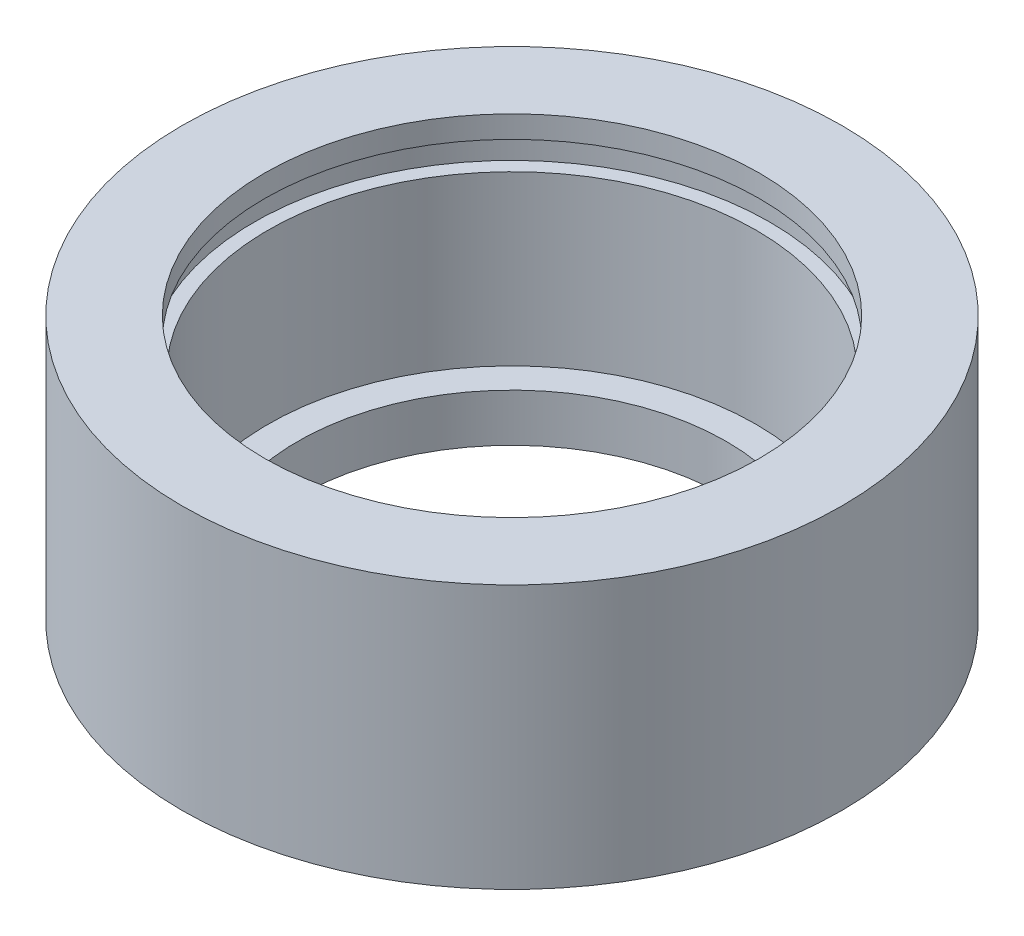
ISO-10303-21;
HEADER;
FILE_DESCRIPTION(('STEP AP214'),'2;1');
FILE_NAME('part.step','',(''),(''),'','','');
FILE_SCHEMA(('AUTOMOTIVE_DESIGN { 1 0 10303 214 1 1 1 1 }'));
ENDSEC;
DATA;
#1=APPLICATION_CONTEXT('core data for automotive mechanical design processes');
#2=APPLICATION_PROTOCOL_DEFINITION('international standard','automotive_design',2000,#1);
#3=PRODUCT_CONTEXT('',#1,'mechanical');
#4=PRODUCT('Part','Part','',(#3));
#5=PRODUCT_RELATED_PRODUCT_CATEGORY('part','',(#4));
#6=PRODUCT_DEFINITION_FORMATION('','',#4);
#7=PRODUCT_DEFINITION_CONTEXT('part definition',#1,'design');
#8=PRODUCT_DEFINITION('design','',#6,#7);
#9=PRODUCT_DEFINITION_SHAPE('','',#8);
#10=(LENGTH_UNIT() NAMED_UNIT(*) SI_UNIT(.MILLI.,.METRE.));
#11=(NAMED_UNIT(*) PLANE_ANGLE_UNIT() SI_UNIT($,.RADIAN.));
#12=(NAMED_UNIT(*) SI_UNIT($,.STERADIAN.) SOLID_ANGLE_UNIT());
#13=UNCERTAINTY_MEASURE_WITH_UNIT(LENGTH_MEASURE(1.E-05),#10,'distance_accuracy_value','');
#14=(GEOMETRIC_REPRESENTATION_CONTEXT(3) GLOBAL_UNCERTAINTY_ASSIGNED_CONTEXT((#13)) GLOBAL_UNIT_ASSIGNED_CONTEXT((#10,
#11,#12)) REPRESENTATION_CONTEXT('',''));
#15=CARTESIAN_POINT('',(0.,0.,0.));
#16=DIRECTION('',(0.,0.,1.));
#17=DIRECTION('',(1.,0.,0.));
#18=AXIS2_PLACEMENT_3D('',#15,#16,#17);
#19=CARTESIAN_POINT('',(0.,0.,0.));
#20=DIRECTION('',(0.,-1.,0.));
#21=DIRECTION('',(0.,0.,-1.));
#22=AXIS2_PLACEMENT_3D('',#19,#20,#21);
#23=CYLINDRICAL_SURFACE('',#22,12.7);
#24=CARTESIAN_POINT('',(0.,-5.08,0.));
#25=DIRECTION('',(0.,-1.,0.));
#26=DIRECTION('',(0.,0.,-1.));
#27=AXIS2_PLACEMENT_3D('',#24,#25,#26);
#28=CIRCLE('',#27,12.7);
#29=CARTESIAN_POINT('',(0.,-5.08,-12.7));
#30=VERTEX_POINT('',#29);
#31=EDGE_CURVE('E10',#30,#30,#28,.T.);
#32=ORIENTED_EDGE('',*,*,#31,.F.);
#33=EDGE_LOOP('',(#32));
#34=FACE_BOUND('',#33,.T.);
#35=CARTESIAN_POINT('',(0.,5.08,0.));
#36=DIRECTION('',(0.,-1.,0.));
#37=DIRECTION('',(0.,0.,-1.));
#38=AXIS2_PLACEMENT_3D('',#35,#36,#37);
#39=CIRCLE('',#38,12.7);
#40=CARTESIAN_POINT('',(0.,5.08,-12.7));
#41=VERTEX_POINT('',#40);
#42=EDGE_CURVE('E70',#41,#41,#39,.T.);
#43=ORIENTED_EDGE('',*,*,#42,.T.);
#44=EDGE_LOOP('',(#43));
#45=FACE_BOUND('',#44,.T.);
#46=ADVANCED_FACE('F36',(#34,#45),#23,.T.);
#47=CARTESIAN_POINT('',(-12.7,-5.08,0.));
#48=DIRECTION('',(0.,1.,0.));
#49=DIRECTION('',(0.,0.,1.));
#50=AXIS2_PLACEMENT_3D('',#47,#48,#49);
#51=PLANE('',#50);
#52=CARTESIAN_POINT('',(0.,-5.08,0.));
#53=DIRECTION('',(0.,-1.,0.));
#54=DIRECTION('',(0.,0.,-1.));
#55=AXIS2_PLACEMENT_3D('',#52,#53,#54);
#56=CIRCLE('',#55,8.255);
#57=CARTESIAN_POINT('',(0.,-5.08,-8.255));
#58=VERTEX_POINT('',#57);
#59=EDGE_CURVE('E42',#58,#58,#56,.T.);
#60=ORIENTED_EDGE('',*,*,#59,.F.);
#61=EDGE_LOOP('',(#60));
#62=FACE_BOUND('',#61,.T.);
#63=ORIENTED_EDGE('',*,*,#31,.T.);
#64=EDGE_LOOP('',(#63));
#65=FACE_BOUND('',#64,.T.);
#66=ADVANCED_FACE('F119',(#62,#65),#51,.F.);
#67=CARTESIAN_POINT('',(0.,0.,0.));
#68=DIRECTION('',(0.,-1.,0.));
#69=DIRECTION('',(0.,0.,-1.));
#70=AXIS2_PLACEMENT_3D('',#67,#68,#69);
#71=CYLINDRICAL_SURFACE('',#70,8.255);
#72=CARTESIAN_POINT('',(0.,-3.2385,0.));
#73=DIRECTION('',(0.,-1.,0.));
#74=DIRECTION('',(0.,0.,-1.));
#75=AXIS2_PLACEMENT_3D('',#72,#73,#74);
#76=CIRCLE('',#75,8.255);
#77=CARTESIAN_POINT('',(0.,-3.2385,-8.255));
#78=VERTEX_POINT('',#77);
#79=EDGE_CURVE('E46',#78,#78,#76,.T.);
#80=ORIENTED_EDGE('',*,*,#79,.F.);
#81=EDGE_LOOP('',(#80));
#82=FACE_BOUND('',#81,.T.);
#83=ORIENTED_EDGE('',*,*,#59,.T.);
#84=EDGE_LOOP('',(#83));
#85=FACE_BOUND('',#84,.T.);
#86=ADVANCED_FACE('F114',(#82,#85),#71,.F.);
#87=CARTESIAN_POINT('',(-8.255,-3.2385,0.));
#88=DIRECTION('',(0.,-1.,0.));
#89=DIRECTION('',(0.,0.,-1.));
#90=AXIS2_PLACEMENT_3D('',#87,#88,#89);
#91=PLANE('',#90);
#92=CARTESIAN_POINT('',(0.,-3.2385,0.));
#93=DIRECTION('',(0.,-1.,0.));
#94=DIRECTION('',(0.,0.,-1.));
#95=AXIS2_PLACEMENT_3D('',#92,#93,#94);
#96=CIRCLE('',#95,9.398);
#97=CARTESIAN_POINT('',(0.,-3.2385,-9.398));
#98=VERTEX_POINT('',#97);
#99=EDGE_CURVE('E50',#98,#98,#96,.T.);
#100=ORIENTED_EDGE('',*,*,#99,.F.);
#101=EDGE_LOOP('',(#100));
#102=FACE_BOUND('',#101,.T.);
#103=ORIENTED_EDGE('',*,*,#79,.T.);
#104=EDGE_LOOP('',(#103));
#105=FACE_BOUND('',#104,.T.);
#106=ADVANCED_FACE('F108',(#102,#105),#91,.F.);
#107=CARTESIAN_POINT('',(0.,0.,0.));
#108=DIRECTION('',(0.,-1.,0.));
#109=DIRECTION('',(0.,0.,-1.));
#110=AXIS2_PLACEMENT_3D('',#107,#108,#109);
#111=CYLINDRICAL_SURFACE('',#110,9.398);
#112=CARTESIAN_POINT('',(0.,3.2385,0.));
#113=DIRECTION('',(0.,-1.,0.));
#114=DIRECTION('',(0.,0.,-1.));
#115=AXIS2_PLACEMENT_3D('',#112,#113,#114);
#116=CIRCLE('',#115,9.398);
#117=CARTESIAN_POINT('',(0.,3.2385,-9.398));
#118=VERTEX_POINT('',#117);
#119=EDGE_CURVE('E55',#118,#118,#116,.T.);
#120=ORIENTED_EDGE('',*,*,#119,.F.);
#121=EDGE_LOOP('',(#120));
#122=FACE_BOUND('',#121,.T.);
#123=ORIENTED_EDGE('',*,*,#99,.T.);
#124=EDGE_LOOP('',(#123));
#125=FACE_BOUND('',#124,.T.);
#126=ADVANCED_FACE('F102',(#122,#125),#111,.F.);
#127=CARTESIAN_POINT('',(-9.398,3.2385,0.));
#128=DIRECTION('',(0.,-1.,0.));
#129=DIRECTION('',(0.,0.,-1.));
#130=AXIS2_PLACEMENT_3D('',#127,#128,#129);
#131=PLANE('',#130);
#132=CARTESIAN_POINT('',(0.,3.2385,0.));
#133=DIRECTION('',(0.,-1.,0.));
#134=DIRECTION('',(0.,0.,-1.));
#135=AXIS2_PLACEMENT_3D('',#132,#133,#134);
#136=CIRCLE('',#135,9.9314);
#137=CARTESIAN_POINT('',(0.,3.2385,-9.9314));
#138=VERTEX_POINT('',#137);
#139=EDGE_CURVE('E58',#138,#138,#136,.T.);
#140=ORIENTED_EDGE('',*,*,#139,.F.);
#141=EDGE_LOOP('',(#140));
#142=FACE_BOUND('',#141,.T.);
#143=ORIENTED_EDGE('',*,*,#119,.T.);
#144=EDGE_LOOP('',(#143));
#145=FACE_BOUND('',#144,.T.);
#146=ADVANCED_FACE('F96',(#142,#145),#131,.F.);
#147=CARTESIAN_POINT('',(0.,0.,0.));
#148=DIRECTION('',(0.,-1.,0.));
#149=DIRECTION('',(0.,0.,-1.));
#150=AXIS2_PLACEMENT_3D('',#147,#148,#149);
#151=CYLINDRICAL_SURFACE('',#150,9.9314);
#152=CARTESIAN_POINT('',(0.,4.2291,0.));
#153=DIRECTION('',(0.,-1.,0.));
#154=DIRECTION('',(0.,0.,-1.));
#155=AXIS2_PLACEMENT_3D('',#152,#153,#154);
#156=CIRCLE('',#155,9.9314);
#157=CARTESIAN_POINT('',(0.,4.2291,-9.9314));
#158=VERTEX_POINT('',#157);
#159=EDGE_CURVE('E61',#158,#158,#156,.T.);
#160=ORIENTED_EDGE('',*,*,#159,.F.);
#161=EDGE_LOOP('',(#160));
#162=FACE_BOUND('',#161,.T.);
#163=ORIENTED_EDGE('',*,*,#139,.T.);
#164=EDGE_LOOP('',(#163));
#165=FACE_BOUND('',#164,.T.);
#166=ADVANCED_FACE('F90',(#162,#165),#151,.F.);
#167=CARTESIAN_POINT('',(-9.9314,4.2291,0.));
#168=DIRECTION('',(0.,1.,0.));
#169=DIRECTION('',(0.,0.,1.));
#170=AXIS2_PLACEMENT_3D('',#167,#168,#169);
#171=PLANE('',#170);
#172=CARTESIAN_POINT('',(0.,4.2291,0.));
#173=DIRECTION('',(0.,-1.,0.));
#174=DIRECTION('',(0.,0.,-1.));
#175=AXIS2_PLACEMENT_3D('',#172,#173,#174);
#176=CIRCLE('',#175,9.525);
#177=CARTESIAN_POINT('',(0.,4.2291,-9.525));
#178=VERTEX_POINT('',#177);
#179=EDGE_CURVE('E64',#178,#178,#176,.T.);
#180=ORIENTED_EDGE('',*,*,#179,.F.);
#181=EDGE_LOOP('',(#180));
#182=FACE_BOUND('',#181,.T.);
#183=ORIENTED_EDGE('',*,*,#159,.T.);
#184=EDGE_LOOP('',(#183));
#185=FACE_BOUND('',#184,.T.);
#186=ADVANCED_FACE('F84',(#182,#185),#171,.F.);
#187=CARTESIAN_POINT('',(0.,0.,0.));
#188=DIRECTION('',(0.,-1.,0.));
#189=DIRECTION('',(0.,0.,-1.));
#190=AXIS2_PLACEMENT_3D('',#187,#188,#189);
#191=CYLINDRICAL_SURFACE('',#190,9.525);
#192=CARTESIAN_POINT('',(0.,5.08,0.));
#193=DIRECTION('',(0.,-1.,0.));
#194=DIRECTION('',(0.,0.,-1.));
#195=AXIS2_PLACEMENT_3D('',#192,#193,#194);
#196=CIRCLE('',#195,9.525);
#197=CARTESIAN_POINT('',(0.,5.08,-9.525));
#198=VERTEX_POINT('',#197);
#199=EDGE_CURVE('E67',#198,#198,#196,.T.);
#200=ORIENTED_EDGE('',*,*,#199,.F.);
#201=EDGE_LOOP('',(#200));
#202=FACE_BOUND('',#201,.T.);
#203=ORIENTED_EDGE('',*,*,#179,.T.);
#204=EDGE_LOOP('',(#203));
#205=FACE_BOUND('',#204,.T.);
#206=ADVANCED_FACE('F78',(#202,#205),#191,.F.);
#207=CARTESIAN_POINT('',(-9.525,5.08,0.));
#208=DIRECTION('',(0.,-1.,0.));
#209=DIRECTION('',(0.,0.,-1.));
#210=AXIS2_PLACEMENT_3D('',#207,#208,#209);
#211=PLANE('',#210);
#212=ORIENTED_EDGE('',*,*,#42,.F.);
#213=EDGE_LOOP('',(#212));
#214=FACE_BOUND('',#213,.T.);
#215=ORIENTED_EDGE('',*,*,#199,.T.);
#216=EDGE_LOOP('',(#215));
#217=FACE_BOUND('',#216,.T.);
#218=ADVANCED_FACE('F75',(#214,#217),#211,.F.);
#219=CLOSED_SHELL('',(#46,#66,#86,#106,#126,#146,#166,#186,#206,#218));
#220=MANIFOLD_SOLID_BREP('B2',#219);
#221=ADVANCED_BREP_SHAPE_REPRESENTATION('',(#18,#220),#14);
#222=SHAPE_DEFINITION_REPRESENTATION(#9,#221);
ENDSEC;
END-ISO-10303-21;
